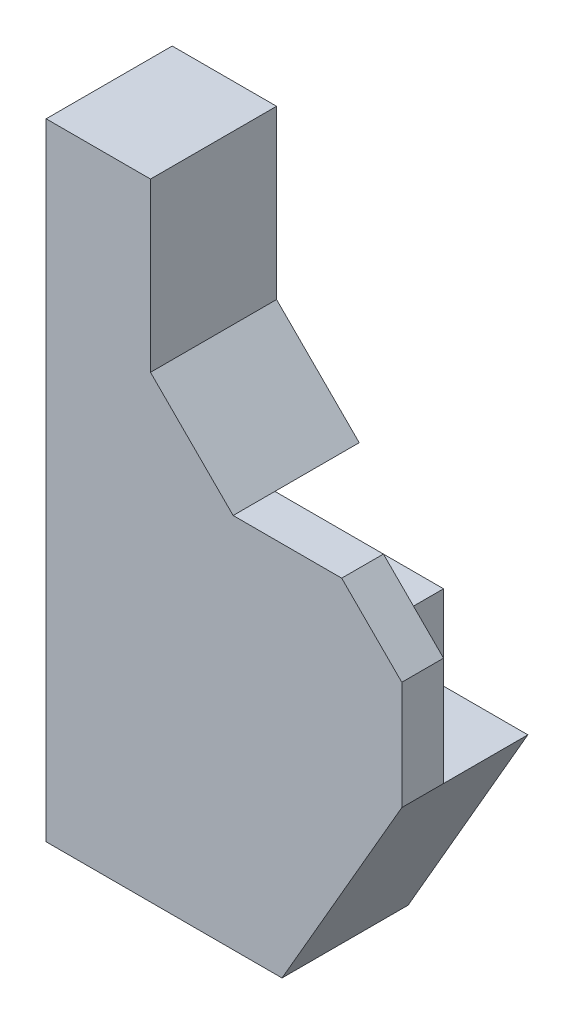
ISO-10303-21;
HEADER;
FILE_DESCRIPTION(('STEP AP214'),'2;1');
FILE_NAME('part.step','',(''),(''),'','','');
FILE_SCHEMA(('AUTOMOTIVE_DESIGN { 1 0 10303 214 1 1 1 1 }'));
ENDSEC;
DATA;
#1=APPLICATION_CONTEXT('core data for automotive mechanical design processes');
#2=APPLICATION_PROTOCOL_DEFINITION('international standard','automotive_design',2000,#1);
#3=PRODUCT_CONTEXT('',#1,'mechanical');
#4=PRODUCT('Part','Part','',(#3));
#5=PRODUCT_RELATED_PRODUCT_CATEGORY('part','',(#4));
#6=PRODUCT_DEFINITION_FORMATION('','',#4);
#7=PRODUCT_DEFINITION_CONTEXT('part definition',#1,'design');
#8=PRODUCT_DEFINITION('design','',#6,#7);
#9=PRODUCT_DEFINITION_SHAPE('','',#8);
#10=(LENGTH_UNIT() NAMED_UNIT(*) SI_UNIT(.MILLI.,.METRE.));
#11=(NAMED_UNIT(*) PLANE_ANGLE_UNIT() SI_UNIT($,.RADIAN.));
#12=(NAMED_UNIT(*) SI_UNIT($,.STERADIAN.) SOLID_ANGLE_UNIT());
#13=UNCERTAINTY_MEASURE_WITH_UNIT(LENGTH_MEASURE(1.E-05),#10,'distance_accuracy_value','');
#14=(GEOMETRIC_REPRESENTATION_CONTEXT(3) GLOBAL_UNCERTAINTY_ASSIGNED_CONTEXT((#13)) GLOBAL_UNIT_ASSIGNED_CONTEXT((#10,
#11,#12)) REPRESENTATION_CONTEXT('',''));
#15=CARTESIAN_POINT('',(0.,0.,0.));
#16=DIRECTION('',(0.,0.,1.));
#17=DIRECTION('',(1.,0.,0.));
#18=AXIS2_PLACEMENT_3D('',#15,#16,#17);
#19=CARTESIAN_POINT('',(56.5056916212753,0.,-10.1));
#20=DIRECTION('',(0.,-1.,0.));
#21=DIRECTION('',(0.,0.,-1.));
#22=AXIS2_PLACEMENT_3D('',#19,#20,#21);
#23=PLANE('',#22);
#24=DIRECTION('',(0.,0.,1.));
#25=VECTOR('',#24,1.);
#26=CARTESIAN_POINT('',(56.5056916212753,0.,-10.1));
#27=LINE('',#26,#25);
#28=CARTESIAN_POINT('',(56.5056916212753,0.,-10.1));
#29=VERTEX_POINT('',#28);
#30=CARTESIAN_POINT('',(56.5056916212753,0.,20.1));
#31=VERTEX_POINT('',#30);
#32=EDGE_CURVE('E48',#29,#31,#27,.T.);
#33=ORIENTED_EDGE('',*,*,#32,.T.);
#34=DIRECTION('',(1.,0.,0.));
#35=VECTOR('',#34,1.);
#36=CARTESIAN_POINT('',(0.,0.,20.1));
#37=LINE('',#36,#35);
#38=CARTESIAN_POINT('',(0.,0.,20.1));
#39=VERTEX_POINT('',#38);
#40=EDGE_CURVE('E335',#39,#31,#37,.T.);
#41=ORIENTED_EDGE('',*,*,#40,.F.);
#42=DIRECTION('',(0.,0.,1.));
#43=VECTOR('',#42,1.);
#44=CARTESIAN_POINT('',(0.,0.,-10.1));
#45=LINE('',#44,#43);
#46=CARTESIAN_POINT('',(0.,0.,-10.1));
#47=VERTEX_POINT('',#46);
#48=EDGE_CURVE('E11',#47,#39,#45,.T.);
#49=ORIENTED_EDGE('',*,*,#48,.F.);
#50=DIRECTION('',(1.,0.,0.));
#51=VECTOR('',#50,1.);
#52=CARTESIAN_POINT('',(56.5056916212753,0.,-10.1));
#53=LINE('',#52,#51);
#54=EDGE_CURVE('E268',#47,#29,#53,.T.);
#55=ORIENTED_EDGE('',*,*,#54,.T.);
#56=EDGE_LOOP('',(#33,#41,#49,#55));
#57=FACE_BOUND('',#56,.T.);
#58=ADVANCED_FACE('F44',(#57),#23,.T.);
#59=CARTESIAN_POINT('',(0.,0.,-10.1));
#60=DIRECTION('',(-1.,0.,0.));
#61=DIRECTION('',(0.,0.,1.));
#62=AXIS2_PLACEMENT_3D('',#59,#60,#61);
#63=PLANE('',#62);
#64=ORIENTED_EDGE('',*,*,#48,.T.);
#65=DIRECTION('',(0.,-1.,0.));
#66=VECTOR('',#65,1.);
#67=CARTESIAN_POINT('',(0.,150.,20.1));
#68=LINE('',#67,#66);
#69=CARTESIAN_POINT('',(0.,150.,20.1));
#70=VERTEX_POINT('',#69);
#71=EDGE_CURVE('E340',#70,#39,#68,.T.);
#72=ORIENTED_EDGE('',*,*,#71,.F.);
#73=DIRECTION('',(0.,0.,1.));
#74=VECTOR('',#73,1.);
#75=CARTESIAN_POINT('',(0.,150.,-10.1));
#76=LINE('',#75,#74);
#77=CARTESIAN_POINT('',(0.,150.,-10.1));
#78=VERTEX_POINT('',#77);
#79=EDGE_CURVE('E52',#78,#70,#76,.T.);
#80=ORIENTED_EDGE('',*,*,#79,.F.);
#81=DIRECTION('',(0.,-1.,0.));
#82=VECTOR('',#81,1.);
#83=CARTESIAN_POINT('',(0.,0.,-10.1));
#84=LINE('',#83,#82);
#85=EDGE_CURVE('E309',#78,#47,#84,.T.);
#86=ORIENTED_EDGE('',*,*,#85,.T.);
#87=EDGE_LOOP('',(#64,#72,#80,#86));
#88=FACE_BOUND('',#87,.T.);
#89=ADVANCED_FACE('F371',(#88),#63,.T.);
#90=CARTESIAN_POINT('',(0.,150.,-10.1));
#91=DIRECTION('',(0.,1.,0.));
#92=DIRECTION('',(0.,0.,1.));
#93=AXIS2_PLACEMENT_3D('',#90,#91,#92);
#94=PLANE('',#93);
#95=ORIENTED_EDGE('',*,*,#79,.T.);
#96=DIRECTION('',(-1.,0.,0.));
#97=VECTOR('',#96,1.);
#98=CARTESIAN_POINT('',(25.,150.,20.1));
#99=LINE('',#98,#97);
#100=CARTESIAN_POINT('',(25.,150.,20.1));
#101=VERTEX_POINT('',#100);
#102=EDGE_CURVE('E364',#101,#70,#99,.T.);
#103=ORIENTED_EDGE('',*,*,#102,.F.);
#104=DIRECTION('',(0.,0.,1.));
#105=VECTOR('',#104,1.);
#106=CARTESIAN_POINT('',(25.,150.,-10.1));
#107=LINE('',#106,#105);
#108=CARTESIAN_POINT('',(25.,150.,-10.1));
#109=VERTEX_POINT('',#108);
#110=EDGE_CURVE('E314',#109,#101,#107,.T.);
#111=ORIENTED_EDGE('',*,*,#110,.F.);
#112=DIRECTION('',(-1.,0.,0.));
#113=VECTOR('',#112,1.);
#114=CARTESIAN_POINT('',(0.,150.,-10.1));
#115=LINE('',#114,#113);
#116=EDGE_CURVE('E307',#109,#78,#115,.T.);
#117=ORIENTED_EDGE('',*,*,#116,.T.);
#118=EDGE_LOOP('',(#95,#103,#111,#117));
#119=FACE_BOUND('',#118,.T.);
#120=ADVANCED_FACE('F400',(#119),#94,.T.);
#121=CARTESIAN_POINT('',(25.,150.,-10.1));
#122=DIRECTION('',(1.,0.,0.));
#123=DIRECTION('',(0.,1.,0.));
#124=AXIS2_PLACEMENT_3D('',#121,#122,#123);
#125=PLANE('',#124);
#126=ORIENTED_EDGE('',*,*,#110,.T.);
#127=DIRECTION('',(0.,1.,0.));
#128=VECTOR('',#127,1.);
#129=CARTESIAN_POINT('',(25.,109.9,20.1));
#130=LINE('',#129,#128);
#131=CARTESIAN_POINT('',(25.,109.9,20.1));
#132=VERTEX_POINT('',#131);
#133=EDGE_CURVE('E361',#132,#101,#130,.T.);
#134=ORIENTED_EDGE('',*,*,#133,.F.);
#135=DIRECTION('',(0.,0.,1.));
#136=VECTOR('',#135,1.);
#137=CARTESIAN_POINT('',(25.,109.9,-10.1));
#138=LINE('',#137,#136);
#139=CARTESIAN_POINT('',(25.,109.9,-10.1));
#140=VERTEX_POINT('',#139);
#141=EDGE_CURVE('E316',#140,#132,#138,.T.);
#142=ORIENTED_EDGE('',*,*,#141,.F.);
#143=DIRECTION('',(0.,1.,0.));
#144=VECTOR('',#143,1.);
#145=CARTESIAN_POINT('',(25.,150.,-10.1));
#146=LINE('',#145,#144);
#147=EDGE_CURVE('E301',#140,#109,#146,.T.);
#148=ORIENTED_EDGE('',*,*,#147,.T.);
#149=EDGE_LOOP('',(#126,#134,#142,#148));
#150=FACE_BOUND('',#149,.T.);
#151=ADVANCED_FACE('F397',(#150),#125,.T.);
#152=CARTESIAN_POINT('',(25.,109.9,-10.1));
#153=DIRECTION('',(0.707106781186549,0.707106781186546,0.));
#154=DIRECTION('',(-0.707106781186546,0.707106781186549,0.));
#155=AXIS2_PLACEMENT_3D('',#152,#153,#154);
#156=PLANE('',#155);
#157=ORIENTED_EDGE('',*,*,#141,.T.);
#158=DIRECTION('',(-0.707106781186546,0.707106781186549,0.));
#159=VECTOR('',#158,1.);
#160=CARTESIAN_POINT('',(44.8000000000001,90.1,20.1));
#161=LINE('',#160,#159);
#162=CARTESIAN_POINT('',(44.8000000000001,90.1,20.1));
#163=VERTEX_POINT('',#162);
#164=EDGE_CURVE('E193',#163,#132,#161,.T.);
#165=ORIENTED_EDGE('',*,*,#164,.F.);
#166=DIRECTION('',(0.,0.,-1.));
#167=VECTOR('',#166,1.);
#168=CARTESIAN_POINT('',(44.8000000000001,90.1,20.1));
#169=LINE('',#168,#167);
#170=CARTESIAN_POINT('',(44.8000000000001,90.1,10.1));
#171=VERTEX_POINT('',#170);
#172=EDGE_CURVE('E192',#163,#171,#169,.T.);
#173=ORIENTED_EDGE('',*,*,#172,.T.);
#174=DIRECTION('',(0.,0.,1.));
#175=VECTOR('',#174,1.);
#176=CARTESIAN_POINT('',(44.8000000000001,90.1,-10.1));
#177=LINE('',#176,#175);
#178=CARTESIAN_POINT('',(44.8000000000001,90.1,-10.1));
#179=VERTEX_POINT('',#178);
#180=EDGE_CURVE('E318',#179,#171,#177,.T.);
#181=ORIENTED_EDGE('',*,*,#180,.F.);
#182=DIRECTION('',(-0.707106781186546,0.707106781186549,0.));
#183=VECTOR('',#182,1.);
#184=CARTESIAN_POINT('',(25.,109.9,-10.1));
#185=LINE('',#184,#183);
#186=EDGE_CURVE('E302',#179,#140,#185,.T.);
#187=ORIENTED_EDGE('',*,*,#186,.T.);
#188=EDGE_LOOP('',(#157,#165,#173,#181,#187));
#189=FACE_BOUND('',#188,.T.);
#190=ADVANCED_FACE('F356',(#189),#156,.T.);
#191=CARTESIAN_POINT('',(5.00000000000004,90.1,-10.1));
#192=DIRECTION('',(0.,-1.,0.));
#193=DIRECTION('',(0.,0.,-1.));
#194=AXIS2_PLACEMENT_3D('',#191,#192,#193);
#195=PLANE('',#194);
#196=ORIENTED_EDGE('',*,*,#180,.T.);
#197=DIRECTION('',(1.,0.,0.));
#198=VECTOR('',#197,1.);
#199=CARTESIAN_POINT('',(5.00000000000004,90.1,10.1));
#200=LINE('',#199,#198);
#201=CARTESIAN_POINT('',(5.00000000000004,90.1,10.1));
#202=VERTEX_POINT('',#201);
#203=EDGE_CURVE('E241',#202,#171,#200,.T.);
#204=ORIENTED_EDGE('',*,*,#203,.F.);
#205=DIRECTION('',(0.,0.,1.));
#206=VECTOR('',#205,1.);
#207=CARTESIAN_POINT('',(5.00000000000004,90.1,-10.1));
#208=LINE('',#207,#206);
#209=CARTESIAN_POINT('',(5.00000000000004,90.1,-10.1));
#210=VERTEX_POINT('',#209);
#211=EDGE_CURVE('E319',#210,#202,#208,.T.);
#212=ORIENTED_EDGE('',*,*,#211,.F.);
#213=DIRECTION('',(1.,0.,0.));
#214=VECTOR('',#213,1.);
#215=CARTESIAN_POINT('',(5.00000000000004,90.1,-10.1));
#216=LINE('',#215,#214);
#217=EDGE_CURVE('E297',#210,#179,#216,.T.);
#218=ORIENTED_EDGE('',*,*,#217,.T.);
#219=EDGE_LOOP('',(#196,#204,#212,#218));
#220=FACE_BOUND('',#219,.T.);
#221=ADVANCED_FACE('F395',(#220),#195,.T.);
#222=CARTESIAN_POINT('',(5.00000000000004,90.1,-10.1));
#223=DIRECTION('',(1.,0.,0.));
#224=DIRECTION('',(0.,0.,-1.));
#225=AXIS2_PLACEMENT_3D('',#222,#223,#224);
#226=PLANE('',#225);
#227=ORIENTED_EDGE('',*,*,#211,.T.);
#228=DIRECTION('',(0.,1.,0.));
#229=VECTOR('',#228,1.);
#230=CARTESIAN_POINT('',(5.00000000000004,90.1,10.1));
#231=LINE('',#230,#229);
#232=CARTESIAN_POINT('',(5.00000000000004,69.9,10.1));
#233=VERTEX_POINT('',#232);
#234=EDGE_CURVE('E244',#233,#202,#231,.T.);
#235=ORIENTED_EDGE('',*,*,#234,.F.);
#236=DIRECTION('',(0.,0.,1.));
#237=VECTOR('',#236,1.);
#238=CARTESIAN_POINT('',(5.00000000000004,69.9,-10.1));
#239=LINE('',#238,#237);
#240=CARTESIAN_POINT('',(5.00000000000004,69.9,-10.1));
#241=VERTEX_POINT('',#240);
#242=EDGE_CURVE('E325',#241,#233,#239,.T.);
#243=ORIENTED_EDGE('',*,*,#242,.F.);
#244=DIRECTION('',(0.,1.,0.));
#245=VECTOR('',#244,1.);
#246=CARTESIAN_POINT('',(5.00000000000004,90.1,-10.1));
#247=LINE('',#246,#245);
#248=EDGE_CURVE('E293',#241,#210,#247,.T.);
#249=ORIENTED_EDGE('',*,*,#248,.T.);
#250=EDGE_LOOP('',(#227,#235,#243,#249));
#251=FACE_BOUND('',#250,.T.);
#252=ADVANCED_FACE('F393',(#251),#226,.T.);
#253=CARTESIAN_POINT('',(65.,69.9,-10.1));
#254=DIRECTION('',(0.,1.,0.));
#255=DIRECTION('',(-1.,0.,0.));
#256=AXIS2_PLACEMENT_3D('',#253,#254,#255);
#257=PLANE('',#256);
#258=ORIENTED_EDGE('',*,*,#242,.T.);
#259=DIRECTION('',(-1.,0.,0.));
#260=VECTOR('',#259,1.);
#261=CARTESIAN_POINT('',(65.,69.9,10.1));
#262=LINE('',#261,#260);
#263=CARTESIAN_POINT('',(65.,69.9,10.1));
#264=VERTEX_POINT('',#263);
#265=EDGE_CURVE('E239',#264,#233,#262,.T.);
#266=ORIENTED_EDGE('',*,*,#265,.F.);
#267=DIRECTION('',(0.,0.,1.));
#268=VECTOR('',#267,1.);
#269=CARTESIAN_POINT('',(65.,69.9,-10.1));
#270=LINE('',#269,#268);
#271=CARTESIAN_POINT('',(65.,69.9,-10.1));
#272=VERTEX_POINT('',#271);
#273=EDGE_CURVE('E322',#272,#264,#270,.T.);
#274=ORIENTED_EDGE('',*,*,#273,.F.);
#275=DIRECTION('',(-1.,0.,0.));
#276=VECTOR('',#275,1.);
#277=CARTESIAN_POINT('',(65.,69.9,-10.1));
#278=LINE('',#277,#276);
#279=EDGE_CURVE('E295',#272,#241,#278,.T.);
#280=ORIENTED_EDGE('',*,*,#279,.T.);
#281=EDGE_LOOP('',(#258,#266,#274,#280));
#282=FACE_BOUND('',#281,.T.);
#283=ADVANCED_FACE('F389',(#282),#257,.T.);
#284=CARTESIAN_POINT('',(65.,49.7,-10.1));
#285=DIRECTION('',(1.,0.,0.));
#286=DIRECTION('',(0.,0.,-1.));
#287=AXIS2_PLACEMENT_3D('',#284,#285,#286);
#288=PLANE('',#287);
#289=ORIENTED_EDGE('',*,*,#273,.T.);
#290=DIRECTION('',(0.,1.,0.));
#291=VECTOR('',#290,1.);
#292=CARTESIAN_POINT('',(65.,49.7,10.1));
#293=LINE('',#292,#291);
#294=CARTESIAN_POINT('',(65.,49.7,10.1));
#295=VERTEX_POINT('',#294);
#296=EDGE_CURVE('E237',#295,#264,#293,.T.);
#297=ORIENTED_EDGE('',*,*,#296,.F.);
#298=DIRECTION('',(0.,0.,1.));
#299=VECTOR('',#298,1.);
#300=CARTESIAN_POINT('',(65.,49.7,-10.1));
#301=LINE('',#300,#299);
#302=CARTESIAN_POINT('',(65.,49.7,-10.1));
#303=VERTEX_POINT('',#302);
#304=EDGE_CURVE('E326',#303,#295,#301,.T.);
#305=ORIENTED_EDGE('',*,*,#304,.F.);
#306=DIRECTION('',(0.,1.,0.));
#307=VECTOR('',#306,1.);
#308=CARTESIAN_POINT('',(65.,49.7,-10.1));
#309=LINE('',#308,#307);
#310=EDGE_CURVE('E286',#303,#272,#309,.T.);
#311=ORIENTED_EDGE('',*,*,#310,.T.);
#312=EDGE_LOOP('',(#289,#297,#305,#311));
#313=FACE_BOUND('',#312,.T.);
#314=ADVANCED_FACE('F383',(#313),#288,.T.);
#315=CARTESIAN_POINT('',(85.2,49.7,-10.1));
#316=DIRECTION('',(0.,1.,0.));
#317=DIRECTION('',(0.,0.,1.));
#318=AXIS2_PLACEMENT_3D('',#315,#316,#317);
#319=PLANE('',#318);
#320=ORIENTED_EDGE('',*,*,#304,.T.);
#321=DIRECTION('',(-1.,0.,0.));
#322=VECTOR('',#321,1.);
#323=CARTESIAN_POINT('',(85.2,49.7,10.1));
#324=LINE('',#323,#322);
#325=CARTESIAN_POINT('',(85.2,49.7,10.1));
#326=VERTEX_POINT('',#325);
#327=EDGE_CURVE('E234',#326,#295,#324,.T.);
#328=ORIENTED_EDGE('',*,*,#327,.F.);
#329=DIRECTION('',(0.,0.,1.));
#330=VECTOR('',#329,1.);
#331=CARTESIAN_POINT('',(85.2,49.7,-10.1));
#332=LINE('',#331,#330);
#333=CARTESIAN_POINT('',(85.2,49.7,-10.1));
#334=VERTEX_POINT('',#333);
#335=EDGE_CURVE('E330',#334,#326,#332,.T.);
#336=ORIENTED_EDGE('',*,*,#335,.F.);
#337=DIRECTION('',(-1.,0.,0.));
#338=VECTOR('',#337,1.);
#339=CARTESIAN_POINT('',(85.2,49.7,-10.1));
#340=LINE('',#339,#338);
#341=EDGE_CURVE('E287',#334,#303,#340,.T.);
#342=ORIENTED_EDGE('',*,*,#341,.T.);
#343=EDGE_LOOP('',(#320,#328,#336,#342));
#344=FACE_BOUND('',#343,.T.);
#345=ADVANCED_FACE('F381',(#344),#319,.T.);
#346=CARTESIAN_POINT('',(85.2,49.7,-10.1));
#347=DIRECTION('',(0.866025403784436,-0.500000000000004,0.));
#348=DIRECTION('',(0.500000000000004,0.866025403784436,0.));
#349=AXIS2_PLACEMENT_3D('',#346,#347,#348);
#350=PLANE('',#349);
#351=ORIENTED_EDGE('',*,*,#335,.T.);
#352=DIRECTION('',(0.,0.,-1.));
#353=VECTOR('',#352,1.);
#354=CARTESIAN_POINT('',(85.2,49.7,20.1));
#355=LINE('',#354,#353);
#356=CARTESIAN_POINT('',(85.2,49.7,20.1));
#357=VERTEX_POINT('',#356);
#358=EDGE_CURVE('E214',#357,#326,#355,.T.);
#359=ORIENTED_EDGE('',*,*,#358,.F.);
#360=DIRECTION('',(0.500000000000004,0.866025403784436,0.));
#361=VECTOR('',#360,1.);
#362=CARTESIAN_POINT('',(56.5056916212753,0.,20.1));
#363=LINE('',#362,#361);
#364=EDGE_CURVE('E338',#31,#357,#363,.T.);
#365=ORIENTED_EDGE('',*,*,#364,.F.);
#366=ORIENTED_EDGE('',*,*,#32,.F.);
#367=DIRECTION('',(0.500000000000004,0.866025403784436,0.));
#368=VECTOR('',#367,1.);
#369=CARTESIAN_POINT('',(85.2,49.7,-10.1));
#370=LINE('',#369,#368);
#371=EDGE_CURVE('E282',#29,#334,#370,.T.);
#372=ORIENTED_EDGE('',*,*,#371,.T.);
#373=EDGE_LOOP('',(#351,#359,#365,#366,#372));
#374=FACE_BOUND('',#373,.T.);
#375=ADVANCED_FACE('F342',(#374),#350,.T.);
#376=CARTESIAN_POINT('',(0.,0.,-10.1));
#377=DIRECTION('',(0.,0.,-1.));
#378=DIRECTION('',(-1.,0.,0.));
#379=AXIS2_PLACEMENT_3D('',#376,#377,#378);
#380=PLANE('',#379);
#381=DIRECTION('',(-1.,0.,0.));
#382=VECTOR('',#381,1.);
#383=CARTESIAN_POINT('',(55.,64.9,-10.1));
#384=LINE('',#383,#382);
#385=CARTESIAN_POINT('',(55.,64.9,-10.1));
#386=VERTEX_POINT('',#385);
#387=CARTESIAN_POINT('',(9.99999999999999,64.9,-10.1));
#388=VERTEX_POINT('',#387);
#389=EDGE_CURVE('E249',#386,#388,#384,.T.);
#390=ORIENTED_EDGE('',*,*,#389,.T.);
#391=DIRECTION('',(0.,-1.,0.));
#392=VECTOR('',#391,1.);
#393=CARTESIAN_POINT('',(9.99999999999999,64.9,-10.1));
#394=LINE('',#393,#392);
#395=CARTESIAN_POINT('',(10.,9.99999999999998,-10.1));
#396=VERTEX_POINT('',#395);
#397=EDGE_CURVE('E253',#388,#396,#394,.T.);
#398=ORIENTED_EDGE('',*,*,#397,.T.);
#399=DIRECTION('',(1.,0.,0.));
#400=VECTOR('',#399,1.);
#401=CARTESIAN_POINT('',(10.,9.99999999999998,-10.1));
#402=LINE('',#401,#400);
#403=CARTESIAN_POINT('',(50.732188929379,9.99999999999998,-10.1));
#404=VERTEX_POINT('',#403);
#405=EDGE_CURVE('E63',#396,#404,#402,.T.);
#406=ORIENTED_EDGE('',*,*,#405,.T.);
#407=DIRECTION('',(0.500000000000004,0.866025403784436,0.));
#408=VECTOR('',#407,1.);
#409=CARTESIAN_POINT('',(50.732188929379,9.99999999999998,-10.1));
#410=LINE('',#409,#408);
#411=CARTESIAN_POINT('',(67.8794919243111,39.7,-10.1));
#412=VERTEX_POINT('',#411);
#413=EDGE_CURVE('E254',#404,#412,#410,.T.);
#414=ORIENTED_EDGE('',*,*,#413,.T.);
#415=DIRECTION('',(-1.,0.,0.));
#416=VECTOR('',#415,1.);
#417=CARTESIAN_POINT('',(67.8794919243111,39.7,-10.1));
#418=LINE('',#417,#416);
#419=CARTESIAN_POINT('',(55.,39.7,-10.1));
#420=VERTEX_POINT('',#419);
#421=EDGE_CURVE('E256',#412,#420,#418,.T.);
#422=ORIENTED_EDGE('',*,*,#421,.T.);
#423=DIRECTION('',(0.,1.,0.));
#424=VECTOR('',#423,1.);
#425=CARTESIAN_POINT('',(55.,39.7,-10.1));
#426=LINE('',#425,#424);
#427=EDGE_CURVE('E261',#420,#386,#426,.T.);
#428=ORIENTED_EDGE('',*,*,#427,.T.);
#429=EDGE_LOOP('',(#390,#398,#406,#414,#422,#428));
#430=FACE_BOUND('',#429,.T.);
#431=ORIENTED_EDGE('',*,*,#54,.F.);
#432=ORIENTED_EDGE('',*,*,#85,.F.);
#433=ORIENTED_EDGE('',*,*,#116,.F.);
#434=ORIENTED_EDGE('',*,*,#147,.F.);
#435=ORIENTED_EDGE('',*,*,#186,.F.);
#436=ORIENTED_EDGE('',*,*,#217,.F.);
#437=ORIENTED_EDGE('',*,*,#248,.F.);
#438=ORIENTED_EDGE('',*,*,#279,.F.);
#439=ORIENTED_EDGE('',*,*,#310,.F.);
#440=ORIENTED_EDGE('',*,*,#341,.F.);
#441=ORIENTED_EDGE('',*,*,#371,.F.);
#442=EDGE_LOOP('',(#431,#432,#433,#434,#435,#436,#437,#438,#439,#440,#441));
#443=FACE_BOUND('',#442,.T.);
#444=ADVANCED_FACE('F374',(#430,#443),#380,.T.);
#445=CARTESIAN_POINT('',(55.,64.9,-10.1));
#446=DIRECTION('',(0.,1.,0.));
#447=DIRECTION('',(-1.,0.,0.));
#448=AXIS2_PLACEMENT_3D('',#445,#446,#447);
#449=PLANE('',#448);
#450=DIRECTION('',(0.,0.,1.));
#451=VECTOR('',#450,1.);
#452=CARTESIAN_POINT('',(55.,64.9,-10.1));
#453=LINE('',#452,#451);
#454=CARTESIAN_POINT('',(55.,64.9,10.1));
#455=VERTEX_POINT('',#454);
#456=EDGE_CURVE('E264',#386,#455,#453,.T.);
#457=ORIENTED_EDGE('',*,*,#456,.T.);
#458=DIRECTION('',(-1.,0.,0.));
#459=VECTOR('',#458,1.);
#460=CARTESIAN_POINT('',(55.,64.9,10.1));
#461=LINE('',#460,#459);
#462=CARTESIAN_POINT('',(9.99999999999999,64.9,10.1));
#463=VERTEX_POINT('',#462);
#464=EDGE_CURVE('E209',#455,#463,#461,.T.);
#465=ORIENTED_EDGE('',*,*,#464,.T.);
#466=DIRECTION('',(0.,0.,1.));
#467=VECTOR('',#466,1.);
#468=CARTESIAN_POINT('',(9.99999999999999,64.9,-10.1));
#469=LINE('',#468,#467);
#470=EDGE_CURVE('E262',#388,#463,#469,.T.);
#471=ORIENTED_EDGE('',*,*,#470,.F.);
#472=ORIENTED_EDGE('',*,*,#389,.F.);
#473=EDGE_LOOP('',(#457,#465,#471,#472));
#474=FACE_BOUND('',#473,.T.);
#475=ADVANCED_FACE('F516',(#474),#449,.F.);
#476=CARTESIAN_POINT('',(55.,39.7,-10.1));
#477=DIRECTION('',(1.,0.,0.));
#478=DIRECTION('',(0.,0.,-1.));
#479=AXIS2_PLACEMENT_3D('',#476,#477,#478);
#480=PLANE('',#479);
#481=DIRECTION('',(0.,0.,1.));
#482=VECTOR('',#481,1.);
#483=CARTESIAN_POINT('',(55.,39.7,-10.1));
#484=LINE('',#483,#482);
#485=CARTESIAN_POINT('',(55.,39.7,10.1));
#486=VERTEX_POINT('',#485);
#487=EDGE_CURVE('E267',#420,#486,#484,.T.);
#488=ORIENTED_EDGE('',*,*,#487,.T.);
#489=DIRECTION('',(0.,1.,0.));
#490=VECTOR('',#489,1.);
#491=CARTESIAN_POINT('',(55.,39.7,10.1));
#492=LINE('',#491,#490);
#493=EDGE_CURVE('E226',#486,#455,#492,.T.);
#494=ORIENTED_EDGE('',*,*,#493,.T.);
#495=ORIENTED_EDGE('',*,*,#456,.F.);
#496=ORIENTED_EDGE('',*,*,#427,.F.);
#497=EDGE_LOOP('',(#488,#494,#495,#496));
#498=FACE_BOUND('',#497,.T.);
#499=ADVANCED_FACE('F518',(#498),#480,.F.);
#500=CARTESIAN_POINT('',(67.8794919243111,39.7,-10.1));
#501=DIRECTION('',(0.,1.,0.));
#502=DIRECTION('',(0.,0.,1.));
#503=AXIS2_PLACEMENT_3D('',#500,#501,#502);
#504=PLANE('',#503);
#505=DIRECTION('',(0.,0.,1.));
#506=VECTOR('',#505,1.);
#507=CARTESIAN_POINT('',(67.8794919243111,39.7,-10.1));
#508=LINE('',#507,#506);
#509=CARTESIAN_POINT('',(67.8794919243111,39.7,10.1));
#510=VERTEX_POINT('',#509);
#511=EDGE_CURVE('E275',#412,#510,#508,.T.);
#512=ORIENTED_EDGE('',*,*,#511,.T.);
#513=DIRECTION('',(-1.,0.,0.));
#514=VECTOR('',#513,1.);
#515=CARTESIAN_POINT('',(67.8794919243111,39.7,10.1));
#516=LINE('',#515,#514);
#517=EDGE_CURVE('E229',#510,#486,#516,.T.);
#518=ORIENTED_EDGE('',*,*,#517,.T.);
#519=ORIENTED_EDGE('',*,*,#487,.F.);
#520=ORIENTED_EDGE('',*,*,#421,.F.);
#521=EDGE_LOOP('',(#512,#518,#519,#520));
#522=FACE_BOUND('',#521,.T.);
#523=ADVANCED_FACE('F520',(#522),#504,.F.);
#524=CARTESIAN_POINT('',(50.732188929379,9.99999999999998,-10.1));
#525=DIRECTION('',(0.866025403784436,-0.500000000000004,0.));
#526=DIRECTION('',(0.500000000000004,0.866025403784436,0.));
#527=AXIS2_PLACEMENT_3D('',#524,#525,#526);
#528=PLANE('',#527);
#529=DIRECTION('',(0.,0.,1.));
#530=VECTOR('',#529,1.);
#531=CARTESIAN_POINT('',(50.732188929379,9.99999999999998,-10.1));
#532=LINE('',#531,#530);
#533=CARTESIAN_POINT('',(50.732188929379,9.99999999999998,10.1));
#534=VERTEX_POINT('',#533);
#535=EDGE_CURVE('E274',#404,#534,#532,.T.);
#536=ORIENTED_EDGE('',*,*,#535,.T.);
#537=DIRECTION('',(0.500000000000004,0.866025403784436,0.));
#538=VECTOR('',#537,1.);
#539=CARTESIAN_POINT('',(50.732188929379,9.99999999999998,10.1));
#540=LINE('',#539,#538);
#541=EDGE_CURVE('E221',#534,#510,#540,.T.);
#542=ORIENTED_EDGE('',*,*,#541,.T.);
#543=ORIENTED_EDGE('',*,*,#511,.F.);
#544=ORIENTED_EDGE('',*,*,#413,.F.);
#545=EDGE_LOOP('',(#536,#542,#543,#544));
#546=FACE_BOUND('',#545,.T.);
#547=ADVANCED_FACE('F521',(#546),#528,.F.);
#548=CARTESIAN_POINT('',(10.,9.99999999999998,-10.1));
#549=DIRECTION('',(0.,-1.,0.));
#550=DIRECTION('',(0.,0.,-1.));
#551=AXIS2_PLACEMENT_3D('',#548,#549,#550);
#552=PLANE('',#551);
#553=DIRECTION('',(0.,0.,1.));
#554=VECTOR('',#553,1.);
#555=CARTESIAN_POINT('',(10.,9.99999999999998,-10.1));
#556=LINE('',#555,#554);
#557=CARTESIAN_POINT('',(10.,9.99999999999998,10.1));
#558=VERTEX_POINT('',#557);
#559=EDGE_CURVE('E279',#396,#558,#556,.T.);
#560=ORIENTED_EDGE('',*,*,#559,.T.);
#561=DIRECTION('',(1.,0.,0.));
#562=VECTOR('',#561,1.);
#563=CARTESIAN_POINT('',(10.,9.99999999999998,10.1));
#564=LINE('',#563,#562);
#565=EDGE_CURVE('E222',#558,#534,#564,.T.);
#566=ORIENTED_EDGE('',*,*,#565,.T.);
#567=ORIENTED_EDGE('',*,*,#535,.F.);
#568=ORIENTED_EDGE('',*,*,#405,.F.);
#569=EDGE_LOOP('',(#560,#566,#567,#568));
#570=FACE_BOUND('',#569,.T.);
#571=ADVANCED_FACE('F526',(#570),#552,.F.);
#572=CARTESIAN_POINT('',(9.99999999999999,64.9,-10.1));
#573=DIRECTION('',(-1.,0.,0.));
#574=DIRECTION('',(0.,-1.,0.));
#575=AXIS2_PLACEMENT_3D('',#572,#573,#574);
#576=PLANE('',#575);
#577=ORIENTED_EDGE('',*,*,#470,.T.);
#578=DIRECTION('',(0.,-1.,0.));
#579=VECTOR('',#578,1.);
#580=CARTESIAN_POINT('',(9.99999999999999,64.9,10.1));
#581=LINE('',#580,#579);
#582=EDGE_CURVE('E213',#463,#558,#581,.T.);
#583=ORIENTED_EDGE('',*,*,#582,.T.);
#584=ORIENTED_EDGE('',*,*,#559,.F.);
#585=ORIENTED_EDGE('',*,*,#397,.F.);
#586=EDGE_LOOP('',(#577,#583,#584,#585));
#587=FACE_BOUND('',#586,.T.);
#588=ADVANCED_FACE('F468',(#587),#576,.F.);
#589=CARTESIAN_POINT('',(0.,0.,10.1));
#590=DIRECTION('',(0.,0.,1.));
#591=DIRECTION('',(1.,0.,0.));
#592=AXIS2_PLACEMENT_3D('',#589,#590,#591);
#593=PLANE('',#592);
#594=ORIENTED_EDGE('',*,*,#464,.F.);
#595=ORIENTED_EDGE('',*,*,#493,.F.);
#596=ORIENTED_EDGE('',*,*,#517,.F.);
#597=ORIENTED_EDGE('',*,*,#541,.F.);
#598=ORIENTED_EDGE('',*,*,#565,.F.);
#599=ORIENTED_EDGE('',*,*,#582,.F.);
#600=EDGE_LOOP('',(#594,#595,#596,#597,#598,#599));
#601=FACE_BOUND('',#600,.T.);
#602=ADVANCED_FACE('F465',(#601),#593,.F.);
#603=DIRECTION('',(0.,1.,0.));
#604=VECTOR('',#603,1.);
#605=CARTESIAN_POINT('',(85.2,75.7000000000001,10.1));
#606=LINE('',#605,#604);
#607=CARTESIAN_POINT('',(85.2,75.7000000000001,10.1));
#608=VERTEX_POINT('',#607);
#609=EDGE_CURVE('E202',#326,#608,#606,.T.);
#610=ORIENTED_EDGE('',*,*,#609,.F.);
#611=ORIENTED_EDGE('',*,*,#327,.T.);
#612=ORIENTED_EDGE('',*,*,#296,.T.);
#613=ORIENTED_EDGE('',*,*,#265,.T.);
#614=ORIENTED_EDGE('',*,*,#234,.T.);
#615=ORIENTED_EDGE('',*,*,#203,.T.);
#616=DIRECTION('',(-1.,0.,0.));
#617=VECTOR('',#616,1.);
#618=CARTESIAN_POINT('',(44.8000000000001,90.1,10.1));
#619=LINE('',#618,#617);
#620=CARTESIAN_POINT('',(70.8000000000001,90.1,10.1));
#621=VERTEX_POINT('',#620);
#622=EDGE_CURVE('E349',#621,#171,#619,.T.);
#623=ORIENTED_EDGE('',*,*,#622,.F.);
#624=DIRECTION('',(-0.707106781186547,0.707106781186549,0.));
#625=VECTOR('',#624,1.);
#626=CARTESIAN_POINT('',(70.8000000000001,90.1,10.1));
#627=LINE('',#626,#625);
#628=EDGE_CURVE('E207',#608,#621,#627,.T.);
#629=ORIENTED_EDGE('',*,*,#628,.F.);
#630=EDGE_LOOP('',(#610,#611,#612,#613,#614,#615,#623,#629));
#631=FACE_BOUND('',#630,.T.);
#632=ADVANCED_FACE('F357',(#631),#593,.F.);
#633=CARTESIAN_POINT('',(70.8000000000001,90.1,20.1));
#634=DIRECTION('',(-0.707106781186549,-0.707106781186547,0.));
#635=DIRECTION('',(0.707106781186547,-0.707106781186549,0.));
#636=AXIS2_PLACEMENT_3D('',#633,#634,#635);
#637=PLANE('',#636);
#638=ORIENTED_EDGE('',*,*,#628,.T.);
#639=DIRECTION('',(0.,0.,-1.));
#640=VECTOR('',#639,1.);
#641=CARTESIAN_POINT('',(70.8000000000001,90.1,20.1));
#642=LINE('',#641,#640);
#643=CARTESIAN_POINT('',(70.8000000000001,90.1,20.1));
#644=VERTEX_POINT('',#643);
#645=EDGE_CURVE('E187',#644,#621,#642,.T.);
#646=ORIENTED_EDGE('',*,*,#645,.F.);
#647=DIRECTION('',(-0.707106781186547,0.707106781186549,0.));
#648=VECTOR('',#647,1.);
#649=CARTESIAN_POINT('',(70.8000000000001,90.1,20.1));
#650=LINE('',#649,#648);
#651=CARTESIAN_POINT('',(85.2,75.7000000000001,20.1));
#652=VERTEX_POINT('',#651);
#653=EDGE_CURVE('E198',#652,#644,#650,.T.);
#654=ORIENTED_EDGE('',*,*,#653,.F.);
#655=DIRECTION('',(0.,0.,-1.));
#656=VECTOR('',#655,1.);
#657=CARTESIAN_POINT('',(85.2,75.7000000000001,20.1));
#658=LINE('',#657,#656);
#659=EDGE_CURVE('E341',#652,#608,#658,.T.);
#660=ORIENTED_EDGE('',*,*,#659,.T.);
#661=EDGE_LOOP('',(#638,#646,#654,#660));
#662=FACE_BOUND('',#661,.T.);
#663=ADVANCED_FACE('F210',(#662),#637,.F.);
#664=CARTESIAN_POINT('',(44.8000000000001,90.1,20.1));
#665=DIRECTION('',(0.,-1.,0.));
#666=DIRECTION('',(0.,0.,-1.));
#667=AXIS2_PLACEMENT_3D('',#664,#665,#666);
#668=PLANE('',#667);
#669=ORIENTED_EDGE('',*,*,#622,.T.);
#670=ORIENTED_EDGE('',*,*,#172,.F.);
#671=DIRECTION('',(-1.,0.,0.));
#672=VECTOR('',#671,1.);
#673=CARTESIAN_POINT('',(44.8000000000001,90.1,20.1));
#674=LINE('',#673,#672);
#675=EDGE_CURVE('E181',#644,#163,#674,.T.);
#676=ORIENTED_EDGE('',*,*,#675,.F.);
#677=ORIENTED_EDGE('',*,*,#645,.T.);
#678=EDGE_LOOP('',(#669,#670,#676,#677));
#679=FACE_BOUND('',#678,.T.);
#680=ADVANCED_FACE('F188',(#679),#668,.F.);
#681=CARTESIAN_POINT('',(85.2,75.7000000000001,20.1));
#682=DIRECTION('',(-1.,0.,0.));
#683=DIRECTION('',(0.,-1.,0.));
#684=AXIS2_PLACEMENT_3D('',#681,#682,#683);
#685=PLANE('',#684);
#686=ORIENTED_EDGE('',*,*,#609,.T.);
#687=ORIENTED_EDGE('',*,*,#659,.F.);
#688=DIRECTION('',(0.,1.,0.));
#689=VECTOR('',#688,1.);
#690=CARTESIAN_POINT('',(85.2,75.7000000000001,20.1));
#691=LINE('',#690,#689);
#692=EDGE_CURVE('E203',#357,#652,#691,.T.);
#693=ORIENTED_EDGE('',*,*,#692,.F.);
#694=ORIENTED_EDGE('',*,*,#358,.T.);
#695=EDGE_LOOP('',(#686,#687,#693,#694));
#696=FACE_BOUND('',#695,.T.);
#697=ADVANCED_FACE('F355',(#696),#685,.F.);
#698=CARTESIAN_POINT('',(0.,0.,20.1));
#699=DIRECTION('',(0.,0.,1.));
#700=DIRECTION('',(1.,0.,0.));
#701=AXIS2_PLACEMENT_3D('',#698,#699,#700);
#702=PLANE('',#701);
#703=ORIENTED_EDGE('',*,*,#653,.T.);
#704=ORIENTED_EDGE('',*,*,#675,.T.);
#705=ORIENTED_EDGE('',*,*,#164,.T.);
#706=ORIENTED_EDGE('',*,*,#133,.T.);
#707=ORIENTED_EDGE('',*,*,#102,.T.);
#708=ORIENTED_EDGE('',*,*,#71,.T.);
#709=ORIENTED_EDGE('',*,*,#40,.T.);
#710=ORIENTED_EDGE('',*,*,#364,.T.);
#711=ORIENTED_EDGE('',*,*,#692,.T.);
#712=EDGE_LOOP('',(#703,#704,#705,#706,#707,#708,#709,#710,#711));
#713=FACE_BOUND('',#712,.T.);
#714=ADVANCED_FACE('F200',(#713),#702,.T.);
#715=CLOSED_SHELL('',(#58,#89,#120,#151,#190,#221,#252,#283,#314,#345,#375,#444,#475,#499,#523,
#547,#571,#588,#602,#632,#663,#680,#697,#714));
#716=MANIFOLD_SOLID_BREP('B2',#715);
#717=ADVANCED_BREP_SHAPE_REPRESENTATION('',(#18,#716),#14);
#718=SHAPE_DEFINITION_REPRESENTATION(#9,#717);
ENDSEC;
END-ISO-10303-21;
